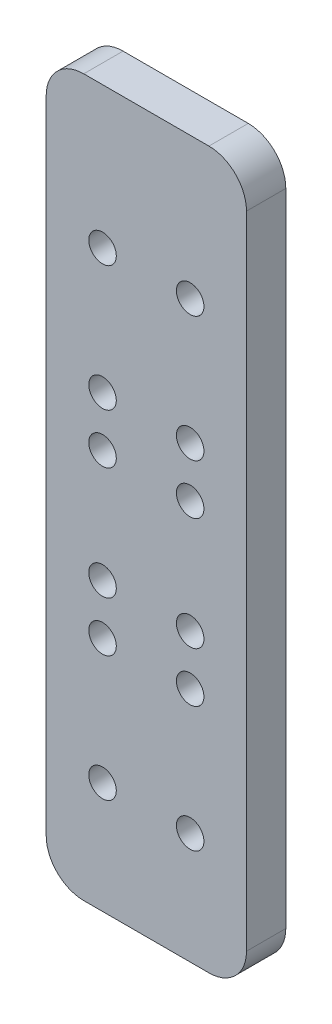
ISO-10303-21;
HEADER;
FILE_DESCRIPTION(('STEP AP214'),'2;1');
FILE_NAME('part.step','',(''),(''),'','','');
FILE_SCHEMA(('AUTOMOTIVE_DESIGN { 1 0 10303 214 1 1 1 1 }'));
ENDSEC;
DATA;
#1=APPLICATION_CONTEXT('core data for automotive mechanical design processes');
#2=APPLICATION_PROTOCOL_DEFINITION('international standard','automotive_design',2000,#1);
#3=PRODUCT_CONTEXT('',#1,'mechanical');
#4=PRODUCT('Part','Part','',(#3));
#5=PRODUCT_RELATED_PRODUCT_CATEGORY('part','',(#4));
#6=PRODUCT_DEFINITION_FORMATION('','',#4);
#7=PRODUCT_DEFINITION_CONTEXT('part definition',#1,'design');
#8=PRODUCT_DEFINITION('design','',#6,#7);
#9=PRODUCT_DEFINITION_SHAPE('','',#8);
#10=(LENGTH_UNIT() NAMED_UNIT(*) SI_UNIT(.MILLI.,.METRE.));
#11=(NAMED_UNIT(*) PLANE_ANGLE_UNIT() SI_UNIT($,.RADIAN.));
#12=(NAMED_UNIT(*) SI_UNIT($,.STERADIAN.) SOLID_ANGLE_UNIT());
#13=UNCERTAINTY_MEASURE_WITH_UNIT(LENGTH_MEASURE(1.E-05),#10,'distance_accuracy_value','');
#14=(GEOMETRIC_REPRESENTATION_CONTEXT(3) GLOBAL_UNCERTAINTY_ASSIGNED_CONTEXT((#13)) GLOBAL_UNIT_ASSIGNED_CONTEXT((#10,
#11,#12)) REPRESENTATION_CONTEXT('',''));
#15=CARTESIAN_POINT('',(0.,0.,0.));
#16=DIRECTION('',(0.,0.,1.));
#17=DIRECTION('',(1.,0.,0.));
#18=AXIS2_PLACEMENT_3D('',#15,#16,#17);
#19=CARTESIAN_POINT('',(4.,14.3,1.57));
#20=DIRECTION('',(0.,0.,1.));
#21=DIRECTION('',(1.,0.,0.));
#22=AXIS2_PLACEMENT_3D('',#19,#20,#21);
#23=PLANE('',#22);
#24=CARTESIAN_POINT('',(2.25,9.45,1.57));
#25=DIRECTION('',(0.,0.,1.));
#26=DIRECTION('',(1.,0.,0.));
#27=AXIS2_PLACEMENT_3D('',#24,#25,#26);
#28=CIRCLE('',#27,0.55);
#29=CARTESIAN_POINT('',(2.8,9.45,1.57));
#30=VERTEX_POINT('',#29);
#31=EDGE_CURVE('E162',#30,#30,#28,.F.);
#32=ORIENTED_EDGE('',*,*,#31,.T.);
#33=EDGE_LOOP('',(#32));
#34=FACE_BOUND('',#33,.T.);
#35=CARTESIAN_POINT('',(2.25,11.45,1.57));
#36=DIRECTION('',(0.,0.,1.));
#37=DIRECTION('',(1.,0.,0.));
#38=AXIS2_PLACEMENT_3D('',#35,#36,#37);
#39=CIRCLE('',#38,0.55);
#40=CARTESIAN_POINT('',(2.8,11.45,1.57));
#41=VERTEX_POINT('',#40);
#42=EDGE_CURVE('E165',#41,#41,#39,.F.);
#43=ORIENTED_EDGE('',*,*,#42,.T.);
#44=EDGE_LOOP('',(#43));
#45=FACE_BOUND('',#44,.T.);
#46=CARTESIAN_POINT('',(5.75,4.45,1.57));
#47=DIRECTION('',(0.,0.,1.));
#48=DIRECTION('',(1.,0.,0.));
#49=AXIS2_PLACEMENT_3D('',#46,#47,#48);
#50=CIRCLE('',#49,0.55);
#51=CARTESIAN_POINT('',(6.3,4.45,1.57));
#52=VERTEX_POINT('',#51);
#53=EDGE_CURVE('E168',#52,#52,#50,.F.);
#54=ORIENTED_EDGE('',*,*,#53,.T.);
#55=EDGE_LOOP('',(#54));
#56=FACE_BOUND('',#55,.T.);
#57=CARTESIAN_POINT('',(5.75,22.95,1.57));
#58=DIRECTION('',(0.,0.,1.));
#59=DIRECTION('',(1.,0.,0.));
#60=AXIS2_PLACEMENT_3D('',#57,#58,#59);
#61=CIRCLE('',#60,0.55);
#62=CARTESIAN_POINT('',(6.3,22.95,1.57));
#63=VERTEX_POINT('',#62);
#64=EDGE_CURVE('E171',#63,#63,#61,.F.);
#65=ORIENTED_EDGE('',*,*,#64,.T.);
#66=EDGE_LOOP('',(#65));
#67=FACE_BOUND('',#66,.T.);
#68=CARTESIAN_POINT('',(2.25,17.95,1.57));
#69=DIRECTION('',(0.,0.,1.));
#70=DIRECTION('',(1.,0.,0.));
#71=AXIS2_PLACEMENT_3D('',#68,#69,#70);
#72=CIRCLE('',#71,0.55);
#73=CARTESIAN_POINT('',(2.8,17.95,1.57));
#74=VERTEX_POINT('',#73);
#75=EDGE_CURVE('E174',#74,#74,#72,.F.);
#76=ORIENTED_EDGE('',*,*,#75,.T.);
#77=EDGE_LOOP('',(#76));
#78=FACE_BOUND('',#77,.T.);
#79=CARTESIAN_POINT('',(2.25,15.95,1.57));
#80=DIRECTION('',(0.,0.,1.));
#81=DIRECTION('',(1.,0.,0.));
#82=AXIS2_PLACEMENT_3D('',#79,#80,#81);
#83=CIRCLE('',#82,0.55);
#84=CARTESIAN_POINT('',(2.8,15.95,1.57));
#85=VERTEX_POINT('',#84);
#86=EDGE_CURVE('E177',#85,#85,#83,.F.);
#87=ORIENTED_EDGE('',*,*,#86,.T.);
#88=EDGE_LOOP('',(#87));
#89=FACE_BOUND('',#88,.T.);
#90=CARTESIAN_POINT('',(2.25,22.95,1.57));
#91=DIRECTION('',(0.,0.,1.));
#92=DIRECTION('',(1.,0.,0.));
#93=AXIS2_PLACEMENT_3D('',#90,#91,#92);
#94=CIRCLE('',#93,0.55);
#95=CARTESIAN_POINT('',(2.8,22.95,1.57));
#96=VERTEX_POINT('',#95);
#97=EDGE_CURVE('E180',#96,#96,#94,.F.);
#98=ORIENTED_EDGE('',*,*,#97,.T.);
#99=EDGE_LOOP('',(#98));
#100=FACE_BOUND('',#99,.T.);
#101=CARTESIAN_POINT('',(5.75,15.95,1.57));
#102=DIRECTION('',(0.,0.,1.));
#103=DIRECTION('',(1.,0.,0.));
#104=AXIS2_PLACEMENT_3D('',#101,#102,#103);
#105=CIRCLE('',#104,0.55);
#106=CARTESIAN_POINT('',(6.3,15.95,1.57));
#107=VERTEX_POINT('',#106);
#108=EDGE_CURVE('E183',#107,#107,#105,.F.);
#109=ORIENTED_EDGE('',*,*,#108,.T.);
#110=EDGE_LOOP('',(#109));
#111=FACE_BOUND('',#110,.T.);
#112=CARTESIAN_POINT('',(5.75,17.95,1.57));
#113=DIRECTION('',(0.,0.,1.));
#114=DIRECTION('',(1.,0.,0.));
#115=AXIS2_PLACEMENT_3D('',#112,#113,#114);
#116=CIRCLE('',#115,0.55);
#117=CARTESIAN_POINT('',(6.3,17.95,1.57));
#118=VERTEX_POINT('',#117);
#119=EDGE_CURVE('E186',#118,#118,#116,.F.);
#120=ORIENTED_EDGE('',*,*,#119,.T.);
#121=EDGE_LOOP('',(#120));
#122=FACE_BOUND('',#121,.T.);
#123=CARTESIAN_POINT('',(2.25,4.45,1.57));
#124=DIRECTION('',(0.,0.,1.));
#125=DIRECTION('',(1.,0.,0.));
#126=AXIS2_PLACEMENT_3D('',#123,#124,#125);
#127=CIRCLE('',#126,0.55);
#128=CARTESIAN_POINT('',(2.8,4.45,1.57));
#129=VERTEX_POINT('',#128);
#130=EDGE_CURVE('E189',#129,#129,#127,.F.);
#131=ORIENTED_EDGE('',*,*,#130,.T.);
#132=EDGE_LOOP('',(#131));
#133=FACE_BOUND('',#132,.T.);
#134=CARTESIAN_POINT('',(5.75,11.45,1.57));
#135=DIRECTION('',(0.,0.,1.));
#136=DIRECTION('',(1.,0.,0.));
#137=AXIS2_PLACEMENT_3D('',#134,#135,#136);
#138=CIRCLE('',#137,0.55);
#139=CARTESIAN_POINT('',(6.3,11.45,1.57));
#140=VERTEX_POINT('',#139);
#141=EDGE_CURVE('E192',#140,#140,#138,.F.);
#142=ORIENTED_EDGE('',*,*,#141,.T.);
#143=EDGE_LOOP('',(#142));
#144=FACE_BOUND('',#143,.T.);
#145=CARTESIAN_POINT('',(5.75,9.45,1.57));
#146=DIRECTION('',(0.,0.,1.));
#147=DIRECTION('',(1.,0.,0.));
#148=AXIS2_PLACEMENT_3D('',#145,#146,#147);
#149=CIRCLE('',#148,0.55);
#150=CARTESIAN_POINT('',(6.3,9.45,1.57));
#151=VERTEX_POINT('',#150);
#152=EDGE_CURVE('E195',#151,#151,#149,.F.);
#153=ORIENTED_EDGE('',*,*,#152,.T.);
#154=EDGE_LOOP('',(#153));
#155=FACE_BOUND('',#154,.T.);
#156=CARTESIAN_POINT('',(1.5,27.1,1.57));
#157=DIRECTION('',(0.,0.,1.));
#158=DIRECTION('',(1.,0.,0.));
#159=AXIS2_PLACEMENT_3D('',#156,#157,#158);
#160=CIRCLE('',#159,1.5);
#161=CARTESIAN_POINT('',(0.,27.1,1.57));
#162=VERTEX_POINT('',#161);
#163=CARTESIAN_POINT('',(1.5,28.6,1.57));
#164=VERTEX_POINT('',#163);
#165=EDGE_CURVE('E200',#162,#164,#160,.F.);
#166=ORIENTED_EDGE('',*,*,#165,.F.);
#167=DIRECTION('',(0.,1.,0.));
#168=VECTOR('',#167,1.);
#169=CARTESIAN_POINT('',(0.,27.1,1.57));
#170=LINE('',#169,#168);
#171=CARTESIAN_POINT('',(0.,1.5,1.57));
#172=VERTEX_POINT('',#171);
#173=EDGE_CURVE('E109',#172,#162,#170,.T.);
#174=ORIENTED_EDGE('',*,*,#173,.F.);
#175=CARTESIAN_POINT('',(1.5,1.5,1.57));
#176=DIRECTION('',(0.,0.,1.));
#177=DIRECTION('',(1.,0.,0.));
#178=AXIS2_PLACEMENT_3D('',#175,#176,#177);
#179=CIRCLE('',#178,1.5);
#180=CARTESIAN_POINT('',(1.5,0.,1.57));
#181=VERTEX_POINT('',#180);
#182=EDGE_CURVE('E96',#181,#172,#179,.F.);
#183=ORIENTED_EDGE('',*,*,#182,.F.);
#184=DIRECTION('',(1.,0.,0.));
#185=VECTOR('',#184,1.);
#186=CARTESIAN_POINT('',(1.5,0.,1.57));
#187=LINE('',#186,#185);
#188=CARTESIAN_POINT('',(6.5,0.,1.57));
#189=VERTEX_POINT('',#188);
#190=EDGE_CURVE('E92',#189,#181,#187,.F.);
#191=ORIENTED_EDGE('',*,*,#190,.F.);
#192=CARTESIAN_POINT('',(6.5,1.5,1.57));
#193=DIRECTION('',(0.,0.,1.));
#194=DIRECTION('',(1.,0.,0.));
#195=AXIS2_PLACEMENT_3D('',#192,#193,#194);
#196=CIRCLE('',#195,1.5);
#197=CARTESIAN_POINT('',(8.,1.5,1.57));
#198=VERTEX_POINT('',#197);
#199=EDGE_CURVE('E20',#198,#189,#196,.F.);
#200=ORIENTED_EDGE('',*,*,#199,.F.);
#201=DIRECTION('',(0.,1.,0.));
#202=VECTOR('',#201,1.);
#203=CARTESIAN_POINT('',(8.,1.5,1.57));
#204=LINE('',#203,#202);
#205=CARTESIAN_POINT('',(8.,27.1,1.57));
#206=VERTEX_POINT('',#205);
#207=EDGE_CURVE('E79',#206,#198,#204,.F.);
#208=ORIENTED_EDGE('',*,*,#207,.F.);
#209=CARTESIAN_POINT('',(6.5,27.1,1.57));
#210=DIRECTION('',(0.,0.,1.));
#211=DIRECTION('',(1.,0.,0.));
#212=AXIS2_PLACEMENT_3D('',#209,#210,#211);
#213=CIRCLE('',#212,1.5);
#214=CARTESIAN_POINT('',(6.5,28.6,1.57));
#215=VERTEX_POINT('',#214);
#216=EDGE_CURVE('E201',#215,#206,#213,.F.);
#217=ORIENTED_EDGE('',*,*,#216,.F.);
#218=DIRECTION('',(1.,0.,0.));
#219=VECTOR('',#218,1.);
#220=CARTESIAN_POINT('',(6.5,28.6,1.57));
#221=LINE('',#220,#219);
#222=EDGE_CURVE('E113',#164,#215,#221,.T.);
#223=ORIENTED_EDGE('',*,*,#222,.F.);
#224=EDGE_LOOP('',(#166,#174,#183,#191,#200,#208,#217,#223));
#225=FACE_BOUND('',#224,.T.);
#226=ADVANCED_FACE('F17',(#34,#45,#56,#67,#78,#89,#100,#111,#122,#133,#144,#155,#225),#23,.T.);
#227=CARTESIAN_POINT('',(1.5,0.,0.));
#228=DIRECTION('',(0.,-1.,0.));
#229=DIRECTION('',(0.,0.,-1.));
#230=AXIS2_PLACEMENT_3D('',#227,#228,#229);
#231=PLANE('',#230);
#232=ORIENTED_EDGE('',*,*,#190,.T.);
#233=DIRECTION('',(0.,0.,1.));
#234=VECTOR('',#233,1.);
#235=CARTESIAN_POINT('',(1.5,0.,0.));
#236=LINE('',#235,#234);
#237=CARTESIAN_POINT('',(1.5,0.,0.));
#238=VERTEX_POINT('',#237);
#239=EDGE_CURVE('E199',#238,#181,#236,.T.);
#240=ORIENTED_EDGE('',*,*,#239,.F.);
#241=DIRECTION('',(1.,0.,0.));
#242=VECTOR('',#241,1.);
#243=CARTESIAN_POINT('',(4.,0.,0.));
#244=LINE('',#243,#242);
#245=CARTESIAN_POINT('',(6.5,0.,0.));
#246=VERTEX_POINT('',#245);
#247=EDGE_CURVE('E103',#238,#246,#244,.T.);
#248=ORIENTED_EDGE('',*,*,#247,.T.);
#249=DIRECTION('',(0.,0.,1.));
#250=VECTOR('',#249,1.);
#251=CARTESIAN_POINT('',(6.5,0.,0.));
#252=LINE('',#251,#250);
#253=EDGE_CURVE('E88',#189,#246,#252,.F.);
#254=ORIENTED_EDGE('',*,*,#253,.F.);
#255=EDGE_LOOP('',(#232,#240,#248,#254));
#256=FACE_BOUND('',#255,.T.);
#257=ADVANCED_FACE('F102',(#256),#231,.T.);
#258=CARTESIAN_POINT('',(6.5,1.5,0.));
#259=DIRECTION('',(0.,0.,1.));
#260=DIRECTION('',(1.,0.,0.));
#261=AXIS2_PLACEMENT_3D('',#258,#259,#260);
#262=CYLINDRICAL_SURFACE('',#261,1.5);
#263=ORIENTED_EDGE('',*,*,#199,.T.);
#264=ORIENTED_EDGE('',*,*,#253,.T.);
#265=CARTESIAN_POINT('',(6.5,1.5,0.));
#266=DIRECTION('',(0.,0.,1.));
#267=DIRECTION('',(1.,0.,0.));
#268=AXIS2_PLACEMENT_3D('',#265,#266,#267);
#269=CIRCLE('',#268,1.5);
#270=CARTESIAN_POINT('',(8.,1.5,0.));
#271=VERTEX_POINT('',#270);
#272=EDGE_CURVE('E160',#246,#271,#269,.T.);
#273=ORIENTED_EDGE('',*,*,#272,.T.);
#274=DIRECTION('',(0.,0.,-1.));
#275=VECTOR('',#274,1.);
#276=CARTESIAN_POINT('',(8.,1.5,0.));
#277=LINE('',#276,#275);
#278=EDGE_CURVE('E90',#198,#271,#277,.T.);
#279=ORIENTED_EDGE('',*,*,#278,.F.);
#280=EDGE_LOOP('',(#263,#264,#273,#279));
#281=FACE_BOUND('',#280,.T.);
#282=ADVANCED_FACE('F85',(#281),#262,.T.);
#283=CARTESIAN_POINT('',(8.,1.5,0.));
#284=DIRECTION('',(1.,0.,0.));
#285=DIRECTION('',(0.,0.,-1.));
#286=AXIS2_PLACEMENT_3D('',#283,#284,#285);
#287=PLANE('',#286);
#288=ORIENTED_EDGE('',*,*,#207,.T.);
#289=ORIENTED_EDGE('',*,*,#278,.T.);
#290=DIRECTION('',(0.,1.,0.));
#291=VECTOR('',#290,1.);
#292=CARTESIAN_POINT('',(8.,14.3,0.));
#293=LINE('',#292,#291);
#294=CARTESIAN_POINT('',(8.,27.1,0.));
#295=VERTEX_POINT('',#294);
#296=EDGE_CURVE('E159',#271,#295,#293,.T.);
#297=ORIENTED_EDGE('',*,*,#296,.T.);
#298=DIRECTION('',(0.,0.,1.));
#299=VECTOR('',#298,1.);
#300=CARTESIAN_POINT('',(8.,27.1,0.));
#301=LINE('',#300,#299);
#302=EDGE_CURVE('E115',#206,#295,#301,.F.);
#303=ORIENTED_EDGE('',*,*,#302,.F.);
#304=EDGE_LOOP('',(#288,#289,#297,#303));
#305=FACE_BOUND('',#304,.T.);
#306=ADVANCED_FACE('F207',(#305),#287,.T.);
#307=CARTESIAN_POINT('',(6.5,27.1,0.));
#308=DIRECTION('',(0.,0.,1.));
#309=DIRECTION('',(1.,0.,0.));
#310=AXIS2_PLACEMENT_3D('',#307,#308,#309);
#311=CYLINDRICAL_SURFACE('',#310,1.5);
#312=ORIENTED_EDGE('',*,*,#216,.T.);
#313=ORIENTED_EDGE('',*,*,#302,.T.);
#314=CARTESIAN_POINT('',(6.5,27.1,0.));
#315=DIRECTION('',(0.,0.,1.));
#316=DIRECTION('',(1.,0.,0.));
#317=AXIS2_PLACEMENT_3D('',#314,#315,#316);
#318=CIRCLE('',#317,1.5);
#319=CARTESIAN_POINT('',(6.5,28.6,0.));
#320=VERTEX_POINT('',#319);
#321=EDGE_CURVE('E156',#295,#320,#318,.T.);
#322=ORIENTED_EDGE('',*,*,#321,.T.);
#323=DIRECTION('',(0.,0.,1.));
#324=VECTOR('',#323,1.);
#325=CARTESIAN_POINT('',(6.5,28.6,0.));
#326=LINE('',#325,#324);
#327=EDGE_CURVE('E114',#215,#320,#326,.F.);
#328=ORIENTED_EDGE('',*,*,#327,.F.);
#329=EDGE_LOOP('',(#312,#313,#322,#328));
#330=FACE_BOUND('',#329,.T.);
#331=ADVANCED_FACE('F228',(#330),#311,.T.);
#332=CARTESIAN_POINT('',(6.5,28.6,0.));
#333=DIRECTION('',(0.,1.,0.));
#334=DIRECTION('',(0.,0.,1.));
#335=AXIS2_PLACEMENT_3D('',#332,#333,#334);
#336=PLANE('',#335);
#337=ORIENTED_EDGE('',*,*,#222,.T.);
#338=ORIENTED_EDGE('',*,*,#327,.T.);
#339=DIRECTION('',(1.,0.,0.));
#340=VECTOR('',#339,1.);
#341=CARTESIAN_POINT('',(4.,28.6,0.));
#342=LINE('',#341,#340);
#343=CARTESIAN_POINT('',(1.5,28.6,0.));
#344=VERTEX_POINT('',#343);
#345=EDGE_CURVE('E155',#320,#344,#342,.F.);
#346=ORIENTED_EDGE('',*,*,#345,.T.);
#347=DIRECTION('',(0.,0.,1.));
#348=VECTOR('',#347,1.);
#349=CARTESIAN_POINT('',(1.5,28.6,0.));
#350=LINE('',#349,#348);
#351=EDGE_CURVE('E111',#164,#344,#350,.F.);
#352=ORIENTED_EDGE('',*,*,#351,.F.);
#353=EDGE_LOOP('',(#337,#338,#346,#352));
#354=FACE_BOUND('',#353,.T.);
#355=ADVANCED_FACE('F224',(#354),#336,.T.);
#356=CARTESIAN_POINT('',(1.5,27.1,0.));
#357=DIRECTION('',(0.,0.,1.));
#358=DIRECTION('',(1.,0.,0.));
#359=AXIS2_PLACEMENT_3D('',#356,#357,#358);
#360=CYLINDRICAL_SURFACE('',#359,1.5);
#361=ORIENTED_EDGE('',*,*,#165,.T.);
#362=ORIENTED_EDGE('',*,*,#351,.T.);
#363=CARTESIAN_POINT('',(1.5,27.1,0.));
#364=DIRECTION('',(0.,0.,1.));
#365=DIRECTION('',(1.,0.,0.));
#366=AXIS2_PLACEMENT_3D('',#363,#364,#365);
#367=CIRCLE('',#366,1.5);
#368=CARTESIAN_POINT('',(0.,27.1,0.));
#369=VERTEX_POINT('',#368);
#370=EDGE_CURVE('E152',#344,#369,#367,.T.);
#371=ORIENTED_EDGE('',*,*,#370,.T.);
#372=DIRECTION('',(0.,0.,1.));
#373=VECTOR('',#372,1.);
#374=CARTESIAN_POINT('',(0.,27.1,0.));
#375=LINE('',#374,#373);
#376=EDGE_CURVE('E110',#162,#369,#375,.F.);
#377=ORIENTED_EDGE('',*,*,#376,.F.);
#378=EDGE_LOOP('',(#361,#362,#371,#377));
#379=FACE_BOUND('',#378,.T.);
#380=ADVANCED_FACE('F236',(#379),#360,.T.);
#381=CARTESIAN_POINT('',(0.,27.1,0.));
#382=DIRECTION('',(-1.,0.,0.));
#383=DIRECTION('',(0.,0.,1.));
#384=AXIS2_PLACEMENT_3D('',#381,#382,#383);
#385=PLANE('',#384);
#386=ORIENTED_EDGE('',*,*,#173,.T.);
#387=ORIENTED_EDGE('',*,*,#376,.T.);
#388=DIRECTION('',(0.,1.,0.));
#389=VECTOR('',#388,1.);
#390=CARTESIAN_POINT('',(0.,14.3,0.));
#391=LINE('',#390,#389);
#392=CARTESIAN_POINT('',(0.,1.5,0.));
#393=VERTEX_POINT('',#392);
#394=EDGE_CURVE('E151',#369,#393,#391,.F.);
#395=ORIENTED_EDGE('',*,*,#394,.T.);
#396=DIRECTION('',(0.,0.,1.));
#397=VECTOR('',#396,1.);
#398=CARTESIAN_POINT('',(0.,1.5,0.));
#399=LINE('',#398,#397);
#400=EDGE_CURVE('E35',#172,#393,#399,.F.);
#401=ORIENTED_EDGE('',*,*,#400,.F.);
#402=EDGE_LOOP('',(#386,#387,#395,#401));
#403=FACE_BOUND('',#402,.T.);
#404=ADVANCED_FACE('F298',(#403),#385,.T.);
#405=CARTESIAN_POINT('',(1.5,1.5,0.));
#406=DIRECTION('',(0.,0.,1.));
#407=DIRECTION('',(1.,0.,0.));
#408=AXIS2_PLACEMENT_3D('',#405,#406,#407);
#409=CYLINDRICAL_SURFACE('',#408,1.5);
#410=ORIENTED_EDGE('',*,*,#182,.T.);
#411=ORIENTED_EDGE('',*,*,#400,.T.);
#412=CARTESIAN_POINT('',(1.5,1.5,0.));
#413=DIRECTION('',(0.,0.,1.));
#414=DIRECTION('',(1.,0.,0.));
#415=AXIS2_PLACEMENT_3D('',#412,#413,#414);
#416=CIRCLE('',#415,1.5);
#417=EDGE_CURVE('E149',#393,#238,#416,.T.);
#418=ORIENTED_EDGE('',*,*,#417,.T.);
#419=ORIENTED_EDGE('',*,*,#239,.T.);
#420=EDGE_LOOP('',(#410,#411,#418,#419));
#421=FACE_BOUND('',#420,.T.);
#422=ADVANCED_FACE('F294',(#421),#409,.T.);
#423=CARTESIAN_POINT('',(5.75,9.45,0.));
#424=DIRECTION('',(0.,0.,1.));
#425=DIRECTION('',(1.,0.,0.));
#426=AXIS2_PLACEMENT_3D('',#423,#424,#425);
#427=CYLINDRICAL_SURFACE('',#426,0.55);
#428=ORIENTED_EDGE('',*,*,#152,.F.);
#429=EDGE_LOOP('',(#428));
#430=FACE_BOUND('',#429,.T.);
#431=CARTESIAN_POINT('',(5.75,9.45,0.));
#432=DIRECTION('',(0.,0.,1.));
#433=DIRECTION('',(1.,0.,0.));
#434=AXIS2_PLACEMENT_3D('',#431,#432,#433);
#435=CIRCLE('',#434,0.55);
#436=CARTESIAN_POINT('',(6.3,9.45,0.));
#437=VERTEX_POINT('',#436);
#438=EDGE_CURVE('E146',#437,#437,#435,.F.);
#439=ORIENTED_EDGE('',*,*,#438,.T.);
#440=EDGE_LOOP('',(#439));
#441=FACE_BOUND('',#440,.T.);
#442=ADVANCED_FACE('F290',(#430,#441),#427,.F.);
#443=CARTESIAN_POINT('',(5.75,11.45,0.));
#444=DIRECTION('',(0.,0.,1.));
#445=DIRECTION('',(1.,0.,0.));
#446=AXIS2_PLACEMENT_3D('',#443,#444,#445);
#447=CYLINDRICAL_SURFACE('',#446,0.55);
#448=ORIENTED_EDGE('',*,*,#141,.F.);
#449=EDGE_LOOP('',(#448));
#450=FACE_BOUND('',#449,.T.);
#451=CARTESIAN_POINT('',(5.75,11.45,0.));
#452=DIRECTION('',(0.,0.,1.));
#453=DIRECTION('',(1.,0.,0.));
#454=AXIS2_PLACEMENT_3D('',#451,#452,#453);
#455=CIRCLE('',#454,0.55);
#456=CARTESIAN_POINT('',(6.3,11.45,0.));
#457=VERTEX_POINT('',#456);
#458=EDGE_CURVE('E143',#457,#457,#455,.F.);
#459=ORIENTED_EDGE('',*,*,#458,.T.);
#460=EDGE_LOOP('',(#459));
#461=FACE_BOUND('',#460,.T.);
#462=ADVANCED_FACE('F286',(#450,#461),#447,.F.);
#463=CARTESIAN_POINT('',(2.25,4.45,0.));
#464=DIRECTION('',(0.,0.,1.));
#465=DIRECTION('',(1.,0.,0.));
#466=AXIS2_PLACEMENT_3D('',#463,#464,#465);
#467=CYLINDRICAL_SURFACE('',#466,0.55);
#468=ORIENTED_EDGE('',*,*,#130,.F.);
#469=EDGE_LOOP('',(#468));
#470=FACE_BOUND('',#469,.T.);
#471=CARTESIAN_POINT('',(2.25,4.45,0.));
#472=DIRECTION('',(0.,0.,1.));
#473=DIRECTION('',(1.,0.,0.));
#474=AXIS2_PLACEMENT_3D('',#471,#472,#473);
#475=CIRCLE('',#474,0.55);
#476=CARTESIAN_POINT('',(2.8,4.45,0.));
#477=VERTEX_POINT('',#476);
#478=EDGE_CURVE('E140',#477,#477,#475,.F.);
#479=ORIENTED_EDGE('',*,*,#478,.T.);
#480=EDGE_LOOP('',(#479));
#481=FACE_BOUND('',#480,.T.);
#482=ADVANCED_FACE('F282',(#470,#481),#467,.F.);
#483=CARTESIAN_POINT('',(5.75,17.95,0.));
#484=DIRECTION('',(0.,0.,1.));
#485=DIRECTION('',(1.,0.,0.));
#486=AXIS2_PLACEMENT_3D('',#483,#484,#485);
#487=CYLINDRICAL_SURFACE('',#486,0.55);
#488=ORIENTED_EDGE('',*,*,#119,.F.);
#489=EDGE_LOOP('',(#488));
#490=FACE_BOUND('',#489,.T.);
#491=CARTESIAN_POINT('',(5.75,17.95,0.));
#492=DIRECTION('',(0.,0.,1.));
#493=DIRECTION('',(1.,0.,0.));
#494=AXIS2_PLACEMENT_3D('',#491,#492,#493);
#495=CIRCLE('',#494,0.55);
#496=CARTESIAN_POINT('',(6.3,17.95,0.));
#497=VERTEX_POINT('',#496);
#498=EDGE_CURVE('E137',#497,#497,#495,.F.);
#499=ORIENTED_EDGE('',*,*,#498,.T.);
#500=EDGE_LOOP('',(#499));
#501=FACE_BOUND('',#500,.T.);
#502=ADVANCED_FACE('F278',(#490,#501),#487,.F.);
#503=CARTESIAN_POINT('',(5.75,15.95,0.));
#504=DIRECTION('',(0.,0.,1.));
#505=DIRECTION('',(1.,0.,0.));
#506=AXIS2_PLACEMENT_3D('',#503,#504,#505);
#507=CYLINDRICAL_SURFACE('',#506,0.55);
#508=ORIENTED_EDGE('',*,*,#108,.F.);
#509=EDGE_LOOP('',(#508));
#510=FACE_BOUND('',#509,.T.);
#511=CARTESIAN_POINT('',(5.75,15.95,0.));
#512=DIRECTION('',(0.,0.,1.));
#513=DIRECTION('',(1.,0.,0.));
#514=AXIS2_PLACEMENT_3D('',#511,#512,#513);
#515=CIRCLE('',#514,0.55);
#516=CARTESIAN_POINT('',(6.3,15.95,0.));
#517=VERTEX_POINT('',#516);
#518=EDGE_CURVE('E134',#517,#517,#515,.F.);
#519=ORIENTED_EDGE('',*,*,#518,.T.);
#520=EDGE_LOOP('',(#519));
#521=FACE_BOUND('',#520,.T.);
#522=ADVANCED_FACE('F274',(#510,#521),#507,.F.);
#523=CARTESIAN_POINT('',(2.25,22.95,0.));
#524=DIRECTION('',(0.,0.,1.));
#525=DIRECTION('',(1.,0.,0.));
#526=AXIS2_PLACEMENT_3D('',#523,#524,#525);
#527=CYLINDRICAL_SURFACE('',#526,0.55);
#528=ORIENTED_EDGE('',*,*,#97,.F.);
#529=EDGE_LOOP('',(#528));
#530=FACE_BOUND('',#529,.T.);
#531=CARTESIAN_POINT('',(2.25,22.95,0.));
#532=DIRECTION('',(0.,0.,1.));
#533=DIRECTION('',(1.,0.,0.));
#534=AXIS2_PLACEMENT_3D('',#531,#532,#533);
#535=CIRCLE('',#534,0.55);
#536=CARTESIAN_POINT('',(2.8,22.95,0.));
#537=VERTEX_POINT('',#536);
#538=EDGE_CURVE('E131',#537,#537,#535,.F.);
#539=ORIENTED_EDGE('',*,*,#538,.T.);
#540=EDGE_LOOP('',(#539));
#541=FACE_BOUND('',#540,.T.);
#542=ADVANCED_FACE('F270',(#530,#541),#527,.F.);
#543=CARTESIAN_POINT('',(2.25,15.95,0.));
#544=DIRECTION('',(0.,0.,1.));
#545=DIRECTION('',(1.,0.,0.));
#546=AXIS2_PLACEMENT_3D('',#543,#544,#545);
#547=CYLINDRICAL_SURFACE('',#546,0.55);
#548=ORIENTED_EDGE('',*,*,#86,.F.);
#549=EDGE_LOOP('',(#548));
#550=FACE_BOUND('',#549,.T.);
#551=CARTESIAN_POINT('',(2.25,15.95,0.));
#552=DIRECTION('',(0.,0.,1.));
#553=DIRECTION('',(1.,0.,0.));
#554=AXIS2_PLACEMENT_3D('',#551,#552,#553);
#555=CIRCLE('',#554,0.55);
#556=CARTESIAN_POINT('',(2.8,15.95,0.));
#557=VERTEX_POINT('',#556);
#558=EDGE_CURVE('E128',#557,#557,#555,.F.);
#559=ORIENTED_EDGE('',*,*,#558,.T.);
#560=EDGE_LOOP('',(#559));
#561=FACE_BOUND('',#560,.T.);
#562=ADVANCED_FACE('F266',(#550,#561),#547,.F.);
#563=CARTESIAN_POINT('',(2.25,17.95,0.));
#564=DIRECTION('',(0.,0.,1.));
#565=DIRECTION('',(1.,0.,0.));
#566=AXIS2_PLACEMENT_3D('',#563,#564,#565);
#567=CYLINDRICAL_SURFACE('',#566,0.55);
#568=ORIENTED_EDGE('',*,*,#75,.F.);
#569=EDGE_LOOP('',(#568));
#570=FACE_BOUND('',#569,.T.);
#571=CARTESIAN_POINT('',(2.25,17.95,0.));
#572=DIRECTION('',(0.,0.,1.));
#573=DIRECTION('',(1.,0.,0.));
#574=AXIS2_PLACEMENT_3D('',#571,#572,#573);
#575=CIRCLE('',#574,0.55);
#576=CARTESIAN_POINT('',(2.8,17.95,0.));
#577=VERTEX_POINT('',#576);
#578=EDGE_CURVE('E125',#577,#577,#575,.F.);
#579=ORIENTED_EDGE('',*,*,#578,.T.);
#580=EDGE_LOOP('',(#579));
#581=FACE_BOUND('',#580,.T.);
#582=ADVANCED_FACE('F262',(#570,#581),#567,.F.);
#583=CARTESIAN_POINT('',(5.75,22.95,0.));
#584=DIRECTION('',(0.,0.,1.));
#585=DIRECTION('',(1.,0.,0.));
#586=AXIS2_PLACEMENT_3D('',#583,#584,#585);
#587=CYLINDRICAL_SURFACE('',#586,0.55);
#588=ORIENTED_EDGE('',*,*,#64,.F.);
#589=EDGE_LOOP('',(#588));
#590=FACE_BOUND('',#589,.T.);
#591=CARTESIAN_POINT('',(5.75,22.95,0.));
#592=DIRECTION('',(0.,0.,1.));
#593=DIRECTION('',(1.,0.,0.));
#594=AXIS2_PLACEMENT_3D('',#591,#592,#593);
#595=CIRCLE('',#594,0.55);
#596=CARTESIAN_POINT('',(6.3,22.95,0.));
#597=VERTEX_POINT('',#596);
#598=EDGE_CURVE('E122',#597,#597,#595,.F.);
#599=ORIENTED_EDGE('',*,*,#598,.T.);
#600=EDGE_LOOP('',(#599));
#601=FACE_BOUND('',#600,.T.);
#602=ADVANCED_FACE('F258',(#590,#601),#587,.F.);
#603=CARTESIAN_POINT('',(5.75,4.45,0.));
#604=DIRECTION('',(0.,0.,1.));
#605=DIRECTION('',(1.,0.,0.));
#606=AXIS2_PLACEMENT_3D('',#603,#604,#605);
#607=CYLINDRICAL_SURFACE('',#606,0.55);
#608=ORIENTED_EDGE('',*,*,#53,.F.);
#609=EDGE_LOOP('',(#608));
#610=FACE_BOUND('',#609,.T.);
#611=CARTESIAN_POINT('',(5.75,4.45,0.));
#612=DIRECTION('',(0.,0.,1.));
#613=DIRECTION('',(1.,0.,0.));
#614=AXIS2_PLACEMENT_3D('',#611,#612,#613);
#615=CIRCLE('',#614,0.55);
#616=CARTESIAN_POINT('',(6.3,4.45,0.));
#617=VERTEX_POINT('',#616);
#618=EDGE_CURVE('E119',#617,#617,#615,.F.);
#619=ORIENTED_EDGE('',*,*,#618,.T.);
#620=EDGE_LOOP('',(#619));
#621=FACE_BOUND('',#620,.T.);
#622=ADVANCED_FACE('F254',(#610,#621),#607,.F.);
#623=CARTESIAN_POINT('',(2.25,11.45,0.));
#624=DIRECTION('',(0.,0.,1.));
#625=DIRECTION('',(1.,0.,0.));
#626=AXIS2_PLACEMENT_3D('',#623,#624,#625);
#627=CYLINDRICAL_SURFACE('',#626,0.55);
#628=ORIENTED_EDGE('',*,*,#42,.F.);
#629=EDGE_LOOP('',(#628));
#630=FACE_BOUND('',#629,.T.);
#631=CARTESIAN_POINT('',(2.25,11.45,0.));
#632=DIRECTION('',(0.,0.,1.));
#633=DIRECTION('',(1.,0.,0.));
#634=AXIS2_PLACEMENT_3D('',#631,#632,#633);
#635=CIRCLE('',#634,0.55);
#636=CARTESIAN_POINT('',(2.8,11.45,0.));
#637=VERTEX_POINT('',#636);
#638=EDGE_CURVE('E26',#637,#637,#635,.F.);
#639=ORIENTED_EDGE('',*,*,#638,.T.);
#640=EDGE_LOOP('',(#639));
#641=FACE_BOUND('',#640,.T.);
#642=ADVANCED_FACE('F246',(#630,#641),#627,.F.);
#643=CARTESIAN_POINT('',(2.25,9.45,0.));
#644=DIRECTION('',(0.,0.,1.));
#645=DIRECTION('',(1.,0.,0.));
#646=AXIS2_PLACEMENT_3D('',#643,#644,#645);
#647=CYLINDRICAL_SURFACE('',#646,0.55);
#648=ORIENTED_EDGE('',*,*,#31,.F.);
#649=EDGE_LOOP('',(#648));
#650=FACE_BOUND('',#649,.T.);
#651=CARTESIAN_POINT('',(2.25,9.45,0.));
#652=DIRECTION('',(0.,0.,1.));
#653=DIRECTION('',(1.,0.,0.));
#654=AXIS2_PLACEMENT_3D('',#651,#652,#653);
#655=CIRCLE('',#654,0.55);
#656=CARTESIAN_POINT('',(2.8,9.45,0.));
#657=VERTEX_POINT('',#656);
#658=EDGE_CURVE('E11',#657,#657,#655,.F.);
#659=ORIENTED_EDGE('',*,*,#658,.T.);
#660=EDGE_LOOP('',(#659));
#661=FACE_BOUND('',#660,.T.);
#662=ADVANCED_FACE('F240',(#650,#661),#647,.F.);
#663=CARTESIAN_POINT('',(4.,14.3,0.));
#664=DIRECTION('',(0.,0.,1.));
#665=DIRECTION('',(1.,0.,0.));
#666=AXIS2_PLACEMENT_3D('',#663,#664,#665);
#667=PLANE('',#666);
#668=ORIENTED_EDGE('',*,*,#658,.F.);
#669=EDGE_LOOP('',(#668));
#670=FACE_BOUND('',#669,.T.);
#671=ORIENTED_EDGE('',*,*,#638,.F.);
#672=EDGE_LOOP('',(#671));
#673=FACE_BOUND('',#672,.T.);
#674=ORIENTED_EDGE('',*,*,#618,.F.);
#675=EDGE_LOOP('',(#674));
#676=FACE_BOUND('',#675,.T.);
#677=ORIENTED_EDGE('',*,*,#598,.F.);
#678=EDGE_LOOP('',(#677));
#679=FACE_BOUND('',#678,.T.);
#680=ORIENTED_EDGE('',*,*,#578,.F.);
#681=EDGE_LOOP('',(#680));
#682=FACE_BOUND('',#681,.T.);
#683=ORIENTED_EDGE('',*,*,#558,.F.);
#684=EDGE_LOOP('',(#683));
#685=FACE_BOUND('',#684,.T.);
#686=ORIENTED_EDGE('',*,*,#538,.F.);
#687=EDGE_LOOP('',(#686));
#688=FACE_BOUND('',#687,.T.);
#689=ORIENTED_EDGE('',*,*,#518,.F.);
#690=EDGE_LOOP('',(#689));
#691=FACE_BOUND('',#690,.T.);
#692=ORIENTED_EDGE('',*,*,#498,.F.);
#693=EDGE_LOOP('',(#692));
#694=FACE_BOUND('',#693,.T.);
#695=ORIENTED_EDGE('',*,*,#478,.F.);
#696=EDGE_LOOP('',(#695));
#697=FACE_BOUND('',#696,.T.);
#698=ORIENTED_EDGE('',*,*,#458,.F.);
#699=EDGE_LOOP('',(#698));
#700=FACE_BOUND('',#699,.T.);
#701=ORIENTED_EDGE('',*,*,#438,.F.);
#702=EDGE_LOOP('',(#701));
#703=FACE_BOUND('',#702,.T.);
#704=ORIENTED_EDGE('',*,*,#394,.F.);
#705=ORIENTED_EDGE('',*,*,#370,.F.);
#706=ORIENTED_EDGE('',*,*,#345,.F.);
#707=ORIENTED_EDGE('',*,*,#321,.F.);
#708=ORIENTED_EDGE('',*,*,#296,.F.);
#709=ORIENTED_EDGE('',*,*,#272,.F.);
#710=ORIENTED_EDGE('',*,*,#247,.F.);
#711=ORIENTED_EDGE('',*,*,#417,.F.);
#712=EDGE_LOOP('',(#704,#705,#706,#707,#708,#709,#710,#711));
#713=FACE_BOUND('',#712,.T.);
#714=ADVANCED_FACE('F211',(#670,#673,#676,#679,#682,#685,#688,#691,#694,#697,#700,#703,#713),
#667,.F.);
#715=CLOSED_SHELL('',(#226,#257,#282,#306,#331,#355,#380,#404,#422,#442,#462,#482,#502,#522,
#542,#562,#582,#602,#622,#642,#662,#714));
#716=MANIFOLD_SOLID_BREP('B1',#715);
#717=ADVANCED_BREP_SHAPE_REPRESENTATION('',(#18,#716),#14);
#718=SHAPE_DEFINITION_REPRESENTATION(#9,#717);
ENDSEC;
END-ISO-10303-21;
